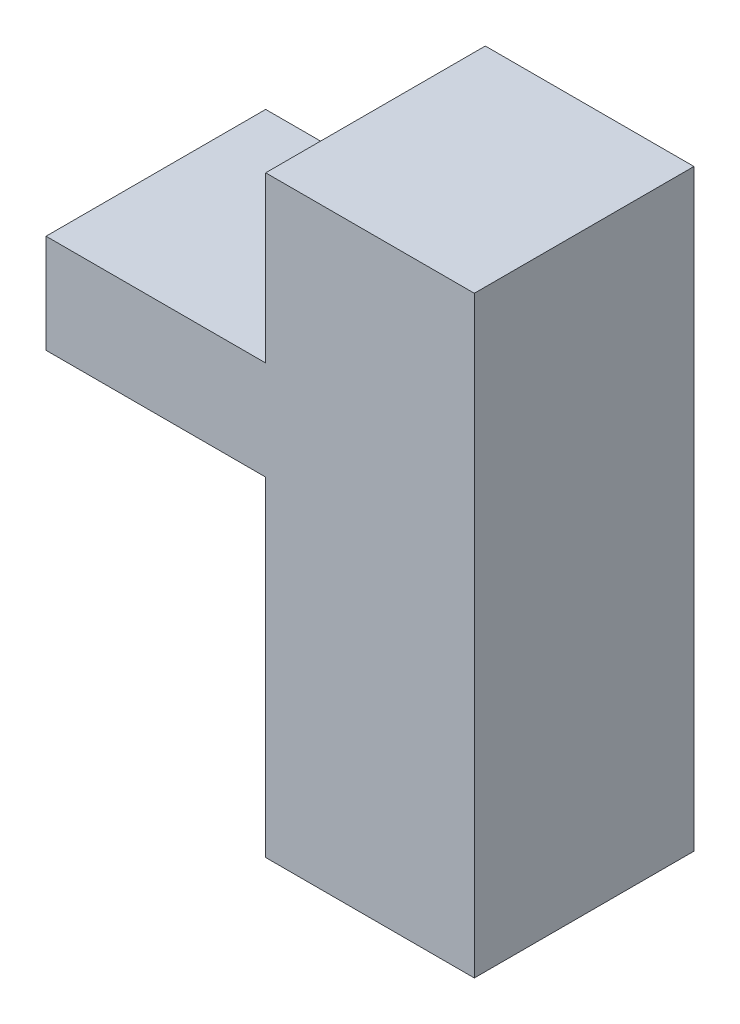
ISO-10303-21;
HEADER;
FILE_DESCRIPTION(('STEP AP214'),'2;1');
FILE_NAME('part.step','',(''),(''),'','','');
FILE_SCHEMA(('AUTOMOTIVE_DESIGN { 1 0 10303 214 1 1 1 1 }'));
ENDSEC;
DATA;
#1=APPLICATION_CONTEXT('core data for automotive mechanical design processes');
#2=APPLICATION_PROTOCOL_DEFINITION('international standard','automotive_design',2000,#1);
#3=PRODUCT_CONTEXT('',#1,'mechanical');
#4=PRODUCT('Part','Part','',(#3));
#5=PRODUCT_RELATED_PRODUCT_CATEGORY('part','',(#4));
#6=PRODUCT_DEFINITION_FORMATION('','',#4);
#7=PRODUCT_DEFINITION_CONTEXT('part definition',#1,'design');
#8=PRODUCT_DEFINITION('design','',#6,#7);
#9=PRODUCT_DEFINITION_SHAPE('','',#8);
#10=(LENGTH_UNIT() NAMED_UNIT(*) SI_UNIT(.MILLI.,.METRE.));
#11=(NAMED_UNIT(*) PLANE_ANGLE_UNIT() SI_UNIT($,.RADIAN.));
#12=(NAMED_UNIT(*) SI_UNIT($,.STERADIAN.) SOLID_ANGLE_UNIT());
#13=UNCERTAINTY_MEASURE_WITH_UNIT(LENGTH_MEASURE(1.E-05),#10,'distance_accuracy_value','');
#14=(GEOMETRIC_REPRESENTATION_CONTEXT(3) GLOBAL_UNCERTAINTY_ASSIGNED_CONTEXT((#13)) GLOBAL_UNIT_ASSIGNED_CONTEXT((#10,
#11,#12)) REPRESENTATION_CONTEXT('',''));
#15=CARTESIAN_POINT('',(0.,0.,0.));
#16=DIRECTION('',(0.,0.,1.));
#17=DIRECTION('',(1.,0.,0.));
#18=AXIS2_PLACEMENT_3D('',#15,#16,#17);
#19=CARTESIAN_POINT('',(0.2,0.2,8.));
#20=DIRECTION('',(1.,0.,0.));
#21=DIRECTION('',(0.,0.,-1.));
#22=AXIS2_PLACEMENT_3D('',#19,#20,#21);
#23=PLANE('',#22);
#24=DIRECTION('',(0.,-1.,0.));
#25=VECTOR('',#24,1.);
#26=CARTESIAN_POINT('',(0.2,0.2,0.));
#27=LINE('',#26,#25);
#28=CARTESIAN_POINT('',(0.2,12.2,0.));
#29=VERTEX_POINT('',#28);
#30=CARTESIAN_POINT('',(0.2,0.2,0.));
#31=VERTEX_POINT('',#30);
#32=EDGE_CURVE('E132',#29,#31,#27,.T.);
#33=ORIENTED_EDGE('',*,*,#32,.T.);
#34=DIRECTION('',(0.,0.,-1.));
#35=VECTOR('',#34,1.);
#36=CARTESIAN_POINT('',(0.2,0.2,8.));
#37=LINE('',#36,#35);
#38=CARTESIAN_POINT('',(0.2,0.2,8.));
#39=VERTEX_POINT('',#38);
#40=EDGE_CURVE('E11',#39,#31,#37,.T.);
#41=ORIENTED_EDGE('',*,*,#40,.F.);
#42=DIRECTION('',(0.,-1.,0.));
#43=VECTOR('',#42,1.);
#44=CARTESIAN_POINT('',(0.2,0.2,8.));
#45=LINE('',#44,#43);
#46=CARTESIAN_POINT('',(0.2,12.2,8.));
#47=VERTEX_POINT('',#46);
#48=EDGE_CURVE('E146',#47,#39,#45,.T.);
#49=ORIENTED_EDGE('',*,*,#48,.F.);
#50=DIRECTION('',(0.,0.,-1.));
#51=VECTOR('',#50,1.);
#52=CARTESIAN_POINT('',(0.2,12.2,8.));
#53=LINE('',#52,#51);
#54=EDGE_CURVE('E128',#47,#29,#53,.T.);
#55=ORIENTED_EDGE('',*,*,#54,.T.);
#56=EDGE_LOOP('',(#33,#41,#49,#55));
#57=FACE_BOUND('',#56,.T.);
#58=ADVANCED_FACE('F36',(#57),#23,.F.);
#59=CARTESIAN_POINT('',(0.2,0.2,8.));
#60=DIRECTION('',(0.,1.,0.));
#61=DIRECTION('',(0.,0.,1.));
#62=AXIS2_PLACEMENT_3D('',#59,#60,#61);
#63=PLANE('',#62);
#64=DIRECTION('',(1.,0.,0.));
#65=VECTOR('',#64,1.);
#66=CARTESIAN_POINT('',(0.2,0.2,0.));
#67=LINE('',#66,#65);
#68=CARTESIAN_POINT('',(7.8,0.2,0.));
#69=VERTEX_POINT('',#68);
#70=EDGE_CURVE('E135',#31,#69,#67,.T.);
#71=ORIENTED_EDGE('',*,*,#70,.T.);
#72=DIRECTION('',(0.,0.,-1.));
#73=VECTOR('',#72,1.);
#74=CARTESIAN_POINT('',(7.8,0.2,8.));
#75=LINE('',#74,#73);
#76=CARTESIAN_POINT('',(7.8,0.2,8.));
#77=VERTEX_POINT('',#76);
#78=EDGE_CURVE('E44',#77,#69,#75,.T.);
#79=ORIENTED_EDGE('',*,*,#78,.F.);
#80=DIRECTION('',(1.,0.,0.));
#81=VECTOR('',#80,1.);
#82=CARTESIAN_POINT('',(0.2,0.2,8.));
#83=LINE('',#82,#81);
#84=EDGE_CURVE('E95',#39,#77,#83,.T.);
#85=ORIENTED_EDGE('',*,*,#84,.F.);
#86=ORIENTED_EDGE('',*,*,#40,.T.);
#87=EDGE_LOOP('',(#71,#79,#85,#86));
#88=FACE_BOUND('',#87,.T.);
#89=ADVANCED_FACE('F181',(#88),#63,.F.);
#90=CARTESIAN_POINT('',(7.8,0.2,8.));
#91=DIRECTION('',(-1.,0.,0.));
#92=DIRECTION('',(0.,0.,1.));
#93=AXIS2_PLACEMENT_3D('',#90,#91,#92);
#94=PLANE('',#93);
#95=DIRECTION('',(0.,1.,0.));
#96=VECTOR('',#95,1.);
#97=CARTESIAN_POINT('',(7.8,0.2,0.));
#98=LINE('',#97,#96);
#99=CARTESIAN_POINT('',(7.8,21.8,0.));
#100=VERTEX_POINT('',#99);
#101=EDGE_CURVE('E137',#69,#100,#98,.T.);
#102=ORIENTED_EDGE('',*,*,#101,.T.);
#103=DIRECTION('',(0.,0.,-1.));
#104=VECTOR('',#103,1.);
#105=CARTESIAN_POINT('',(7.8,21.8,8.));
#106=LINE('',#105,#104);
#107=CARTESIAN_POINT('',(7.8,21.8,8.));
#108=VERTEX_POINT('',#107);
#109=EDGE_CURVE('E153',#108,#100,#106,.T.);
#110=ORIENTED_EDGE('',*,*,#109,.F.);
#111=DIRECTION('',(0.,1.,0.));
#112=VECTOR('',#111,1.);
#113=CARTESIAN_POINT('',(7.8,0.2,8.));
#114=LINE('',#113,#112);
#115=EDGE_CURVE('E161',#77,#108,#114,.T.);
#116=ORIENTED_EDGE('',*,*,#115,.F.);
#117=ORIENTED_EDGE('',*,*,#78,.T.);
#118=EDGE_LOOP('',(#102,#110,#116,#117));
#119=FACE_BOUND('',#118,.T.);
#120=ADVANCED_FACE('F159',(#119),#94,.F.);
#121=CARTESIAN_POINT('',(0.2,21.8,8.));
#122=DIRECTION('',(0.,-1.,0.));
#123=DIRECTION('',(0.,0.,-1.));
#124=AXIS2_PLACEMENT_3D('',#121,#122,#123);
#125=PLANE('',#124);
#126=DIRECTION('',(-1.,0.,0.));
#127=VECTOR('',#126,1.);
#128=CARTESIAN_POINT('',(0.2,21.8,0.));
#129=LINE('',#128,#127);
#130=CARTESIAN_POINT('',(0.2,21.8,0.));
#131=VERTEX_POINT('',#130);
#132=EDGE_CURVE('E139',#100,#131,#129,.T.);
#133=ORIENTED_EDGE('',*,*,#132,.T.);
#134=DIRECTION('',(0.,0.,-1.));
#135=VECTOR('',#134,1.);
#136=CARTESIAN_POINT('',(0.2,21.8,8.));
#137=LINE('',#136,#135);
#138=CARTESIAN_POINT('',(0.2,21.8,8.));
#139=VERTEX_POINT('',#138);
#140=EDGE_CURVE('E150',#139,#131,#137,.T.);
#141=ORIENTED_EDGE('',*,*,#140,.F.);
#142=DIRECTION('',(-1.,0.,0.));
#143=VECTOR('',#142,1.);
#144=CARTESIAN_POINT('',(0.2,21.8,8.));
#145=LINE('',#144,#143);
#146=EDGE_CURVE('E173',#108,#139,#145,.T.);
#147=ORIENTED_EDGE('',*,*,#146,.F.);
#148=ORIENTED_EDGE('',*,*,#109,.T.);
#149=EDGE_LOOP('',(#133,#141,#147,#148));
#150=FACE_BOUND('',#149,.T.);
#151=ADVANCED_FACE('F169',(#150),#125,.F.);
#152=CARTESIAN_POINT('',(0.2,15.8,8.));
#153=DIRECTION('',(1.,0.,0.));
#154=DIRECTION('',(0.,0.,-1.));
#155=AXIS2_PLACEMENT_3D('',#152,#153,#154);
#156=PLANE('',#155);
#157=DIRECTION('',(0.,-1.,0.));
#158=VECTOR('',#157,1.);
#159=CARTESIAN_POINT('',(0.2,15.8,0.));
#160=LINE('',#159,#158);
#161=CARTESIAN_POINT('',(0.2,15.8,0.));
#162=VERTEX_POINT('',#161);
#163=EDGE_CURVE('E141',#131,#162,#160,.T.);
#164=ORIENTED_EDGE('',*,*,#163,.T.);
#165=DIRECTION('',(0.,0.,-1.));
#166=VECTOR('',#165,1.);
#167=CARTESIAN_POINT('',(0.2,15.8,8.));
#168=LINE('',#167,#166);
#169=CARTESIAN_POINT('',(0.2,15.8,8.));
#170=VERTEX_POINT('',#169);
#171=EDGE_CURVE('E123',#170,#162,#168,.T.);
#172=ORIENTED_EDGE('',*,*,#171,.F.);
#173=DIRECTION('',(0.,-1.,0.));
#174=VECTOR('',#173,1.);
#175=CARTESIAN_POINT('',(0.2,15.8,8.));
#176=LINE('',#175,#174);
#177=EDGE_CURVE('E114',#139,#170,#176,.T.);
#178=ORIENTED_EDGE('',*,*,#177,.F.);
#179=ORIENTED_EDGE('',*,*,#140,.T.);
#180=EDGE_LOOP('',(#164,#172,#178,#179));
#181=FACE_BOUND('',#180,.T.);
#182=ADVANCED_FACE('F172',(#181),#156,.F.);
#183=CARTESIAN_POINT('',(0.2,15.8,8.));
#184=DIRECTION('',(0.,-1.,0.));
#185=DIRECTION('',(0.,0.,-1.));
#186=AXIS2_PLACEMENT_3D('',#183,#184,#185);
#187=PLANE('',#186);
#188=DIRECTION('',(-1.,0.,0.));
#189=VECTOR('',#188,1.);
#190=CARTESIAN_POINT('',(0.2,15.8,0.));
#191=LINE('',#190,#189);
#192=CARTESIAN_POINT('',(-7.8,15.8,0.));
#193=VERTEX_POINT('',#192);
#194=EDGE_CURVE('E122',#162,#193,#191,.T.);
#195=ORIENTED_EDGE('',*,*,#194,.T.);
#196=DIRECTION('',(0.,0.,-1.));
#197=VECTOR('',#196,1.);
#198=CARTESIAN_POINT('',(-7.8,15.8,8.));
#199=LINE('',#198,#197);
#200=CARTESIAN_POINT('',(-7.8,15.8,8.));
#201=VERTEX_POINT('',#200);
#202=EDGE_CURVE('E119',#201,#193,#199,.T.);
#203=ORIENTED_EDGE('',*,*,#202,.F.);
#204=DIRECTION('',(-1.,0.,0.));
#205=VECTOR('',#204,1.);
#206=CARTESIAN_POINT('',(0.2,15.8,8.));
#207=LINE('',#206,#205);
#208=EDGE_CURVE('E108',#170,#201,#207,.T.);
#209=ORIENTED_EDGE('',*,*,#208,.F.);
#210=ORIENTED_EDGE('',*,*,#171,.T.);
#211=EDGE_LOOP('',(#195,#203,#209,#210));
#212=FACE_BOUND('',#211,.T.);
#213=ADVANCED_FACE('F120',(#212),#187,.F.);
#214=CARTESIAN_POINT('',(-7.8,15.8,8.));
#215=DIRECTION('',(1.,0.,0.));
#216=DIRECTION('',(0.,0.,-1.));
#217=AXIS2_PLACEMENT_3D('',#214,#215,#216);
#218=PLANE('',#217);
#219=DIRECTION('',(0.,-1.,0.));
#220=VECTOR('',#219,1.);
#221=CARTESIAN_POINT('',(-7.8,15.8,0.));
#222=LINE('',#221,#220);
#223=CARTESIAN_POINT('',(-7.8,12.2,0.));
#224=VERTEX_POINT('',#223);
#225=EDGE_CURVE('E81',#193,#224,#222,.T.);
#226=ORIENTED_EDGE('',*,*,#225,.T.);
#227=DIRECTION('',(0.,0.,-1.));
#228=VECTOR('',#227,1.);
#229=CARTESIAN_POINT('',(-7.8,12.2,8.));
#230=LINE('',#229,#228);
#231=CARTESIAN_POINT('',(-7.8,12.2,8.));
#232=VERTEX_POINT('',#231);
#233=EDGE_CURVE('E124',#232,#224,#230,.T.);
#234=ORIENTED_EDGE('',*,*,#233,.F.);
#235=DIRECTION('',(0.,-1.,0.));
#236=VECTOR('',#235,1.);
#237=CARTESIAN_POINT('',(-7.8,15.8,8.));
#238=LINE('',#237,#236);
#239=EDGE_CURVE('E112',#201,#232,#238,.T.);
#240=ORIENTED_EDGE('',*,*,#239,.F.);
#241=ORIENTED_EDGE('',*,*,#202,.T.);
#242=EDGE_LOOP('',(#226,#234,#240,#241));
#243=FACE_BOUND('',#242,.T.);
#244=ADVANCED_FACE('F126',(#243),#218,.F.);
#245=CARTESIAN_POINT('',(0.2,12.2,8.));
#246=DIRECTION('',(0.,1.,0.));
#247=DIRECTION('',(0.,0.,1.));
#248=AXIS2_PLACEMENT_3D('',#245,#246,#247);
#249=PLANE('',#248);
#250=DIRECTION('',(1.,0.,0.));
#251=VECTOR('',#250,1.);
#252=CARTESIAN_POINT('',(0.2,12.2,0.));
#253=LINE('',#252,#251);
#254=EDGE_CURVE('E87',#224,#29,#253,.T.);
#255=ORIENTED_EDGE('',*,*,#254,.T.);
#256=ORIENTED_EDGE('',*,*,#54,.F.);
#257=DIRECTION('',(1.,0.,0.));
#258=VECTOR('',#257,1.);
#259=CARTESIAN_POINT('',(0.2,12.2,8.));
#260=LINE('',#259,#258);
#261=EDGE_CURVE('E52',#232,#47,#260,.T.);
#262=ORIENTED_EDGE('',*,*,#261,.F.);
#263=ORIENTED_EDGE('',*,*,#233,.T.);
#264=EDGE_LOOP('',(#255,#256,#262,#263));
#265=FACE_BOUND('',#264,.T.);
#266=ADVANCED_FACE('F197',(#265),#249,.F.);
#267=CARTESIAN_POINT('',(0.,0.,8.));
#268=DIRECTION('',(0.,0.,1.));
#269=DIRECTION('',(1.,0.,0.));
#270=AXIS2_PLACEMENT_3D('',#267,#268,#269);
#271=PLANE('',#270);
#272=ORIENTED_EDGE('',*,*,#48,.T.);
#273=ORIENTED_EDGE('',*,*,#84,.T.);
#274=ORIENTED_EDGE('',*,*,#115,.T.);
#275=ORIENTED_EDGE('',*,*,#146,.T.);
#276=ORIENTED_EDGE('',*,*,#177,.T.);
#277=ORIENTED_EDGE('',*,*,#208,.T.);
#278=ORIENTED_EDGE('',*,*,#239,.T.);
#279=ORIENTED_EDGE('',*,*,#261,.T.);
#280=EDGE_LOOP('',(#272,#273,#274,#275,#276,#277,#278,#279));
#281=FACE_BOUND('',#280,.T.);
#282=ADVANCED_FACE('F110',(#281),#271,.T.);
#283=CARTESIAN_POINT('',(0.,0.,0.));
#284=DIRECTION('',(0.,0.,1.));
#285=DIRECTION('',(1.,0.,0.));
#286=AXIS2_PLACEMENT_3D('',#283,#284,#285);
#287=PLANE('',#286);
#288=ORIENTED_EDGE('',*,*,#32,.F.);
#289=ORIENTED_EDGE('',*,*,#254,.F.);
#290=ORIENTED_EDGE('',*,*,#225,.F.);
#291=ORIENTED_EDGE('',*,*,#194,.F.);
#292=ORIENTED_EDGE('',*,*,#163,.F.);
#293=ORIENTED_EDGE('',*,*,#132,.F.);
#294=ORIENTED_EDGE('',*,*,#101,.F.);
#295=ORIENTED_EDGE('',*,*,#70,.F.);
#296=EDGE_LOOP('',(#288,#289,#290,#291,#292,#293,#294,#295));
#297=FACE_BOUND('',#296,.T.);
#298=ADVANCED_FACE('F165',(#297),#287,.F.);
#299=CLOSED_SHELL('',(#58,#89,#120,#151,#182,#213,#244,#266,#282,#298));
#300=MANIFOLD_SOLID_BREP('B2',#299);
#301=ADVANCED_BREP_SHAPE_REPRESENTATION('',(#18,#300),#14);
#302=SHAPE_DEFINITION_REPRESENTATION(#9,#301);
ENDSEC;
END-ISO-10303-21;
